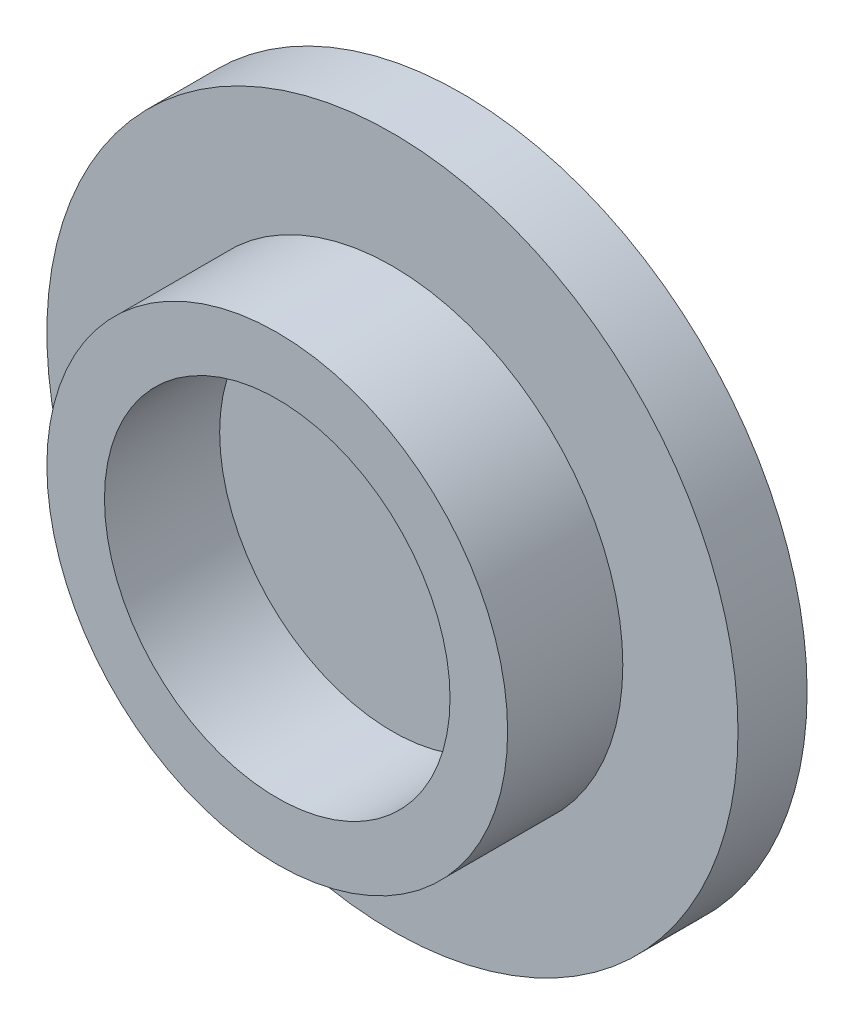
ISO-10303-21;
HEADER;
FILE_DESCRIPTION(('STEP AP214'),'2;1');
FILE_NAME('part.step','',(''),(''),'','','');
FILE_SCHEMA(('AUTOMOTIVE_DESIGN { 1 0 10303 214 1 1 1 1 }'));
ENDSEC;
DATA;
#1=APPLICATION_CONTEXT('core data for automotive mechanical design processes');
#2=APPLICATION_PROTOCOL_DEFINITION('international standard','automotive_design',2000,#1);
#3=PRODUCT_CONTEXT('',#1,'mechanical');
#4=PRODUCT('Part','Part','',(#3));
#5=PRODUCT_RELATED_PRODUCT_CATEGORY('part','',(#4));
#6=PRODUCT_DEFINITION_FORMATION('','',#4);
#7=PRODUCT_DEFINITION_CONTEXT('part definition',#1,'design');
#8=PRODUCT_DEFINITION('design','',#6,#7);
#9=PRODUCT_DEFINITION_SHAPE('','',#8);
#10=(LENGTH_UNIT() NAMED_UNIT(*) SI_UNIT(.MILLI.,.METRE.));
#11=(NAMED_UNIT(*) PLANE_ANGLE_UNIT() SI_UNIT($,.RADIAN.));
#12=(NAMED_UNIT(*) SI_UNIT($,.STERADIAN.) SOLID_ANGLE_UNIT());
#13=UNCERTAINTY_MEASURE_WITH_UNIT(LENGTH_MEASURE(1.E-05),#10,'distance_accuracy_value','');
#14=(GEOMETRIC_REPRESENTATION_CONTEXT(3) GLOBAL_UNCERTAINTY_ASSIGNED_CONTEXT((#13)) GLOBAL_UNIT_ASSIGNED_CONTEXT((#10,
#11,#12)) REPRESENTATION_CONTEXT('',''));
#15=CARTESIAN_POINT('',(0.,0.,0.));
#16=DIRECTION('',(0.,0.,1.));
#17=DIRECTION('',(1.,0.,0.));
#18=AXIS2_PLACEMENT_3D('',#15,#16,#17);
#19=CARTESIAN_POINT('',(0.,0.,3.));
#20=DIRECTION('',(0.,0.,-1.));
#21=DIRECTION('',(-1.,0.,0.));
#22=AXIS2_PLACEMENT_3D('',#19,#20,#21);
#23=CYLINDRICAL_SURFACE('',#22,15.);
#24=CARTESIAN_POINT('',(0.,0.,3.));
#25=DIRECTION('',(0.,0.,1.));
#26=DIRECTION('',(1.,0.,0.));
#27=AXIS2_PLACEMENT_3D('',#24,#25,#26);
#28=CIRCLE('',#27,15.);
#29=CARTESIAN_POINT('',(15.,0.,3.));
#30=VERTEX_POINT('',#29);
#31=EDGE_CURVE('E38',#30,#30,#28,.T.);
#32=ORIENTED_EDGE('',*,*,#31,.F.);
#33=EDGE_LOOP('',(#32));
#34=FACE_BOUND('',#33,.T.);
#35=CARTESIAN_POINT('',(0.,0.,0.));
#36=DIRECTION('',(0.,0.,1.));
#37=DIRECTION('',(1.,0.,0.));
#38=AXIS2_PLACEMENT_3D('',#35,#36,#37);
#39=CIRCLE('',#38,15.);
#40=CARTESIAN_POINT('',(15.,0.,0.));
#41=VERTEX_POINT('',#40);
#42=EDGE_CURVE('E42',#41,#41,#39,.T.);
#43=ORIENTED_EDGE('',*,*,#42,.T.);
#44=EDGE_LOOP('',(#43));
#45=FACE_BOUND('',#44,.T.);
#46=ADVANCED_FACE('F32',(#34,#45),#23,.T.);
#47=CARTESIAN_POINT('',(0.,0.,3.));
#48=DIRECTION('',(0.,0.,1.));
#49=DIRECTION('',(1.,0.,0.));
#50=AXIS2_PLACEMENT_3D('',#47,#48,#49);
#51=PLANE('',#50);
#52=CARTESIAN_POINT('',(0.,0.,3.));
#53=DIRECTION('',(0.,0.,1.));
#54=DIRECTION('',(1.,0.,0.));
#55=AXIS2_PLACEMENT_3D('',#52,#53,#54);
#56=CIRCLE('',#55,10.);
#57=CARTESIAN_POINT('',(10.,0.,3.));
#58=VERTEX_POINT('',#57);
#59=EDGE_CURVE('E49',#58,#58,#56,.T.);
#60=ORIENTED_EDGE('',*,*,#59,.F.);
#61=EDGE_LOOP('',(#60));
#62=FACE_BOUND('',#61,.T.);
#63=ORIENTED_EDGE('',*,*,#31,.T.);
#64=EDGE_LOOP('',(#63));
#65=FACE_BOUND('',#64,.T.);
#66=ADVANCED_FACE('F72',(#62,#65),#51,.T.);
#67=CARTESIAN_POINT('',(0.,0.,0.));
#68=DIRECTION('',(0.,0.,1.));
#69=DIRECTION('',(1.,0.,0.));
#70=AXIS2_PLACEMENT_3D('',#67,#68,#69);
#71=PLANE('',#70);
#72=ORIENTED_EDGE('',*,*,#42,.F.);
#73=EDGE_LOOP('',(#72));
#74=FACE_BOUND('',#73,.T.);
#75=ADVANCED_FACE('F63',(#74),#71,.F.);
#76=CARTESIAN_POINT('',(0.,0.,8.));
#77=DIRECTION('',(0.,0.,1.));
#78=DIRECTION('',(1.,0.,0.));
#79=AXIS2_PLACEMENT_3D('',#76,#77,#78);
#80=PLANE('',#79);
#81=CARTESIAN_POINT('',(0.,0.,8.));
#82=DIRECTION('',(0.,0.,1.));
#83=DIRECTION('',(1.,0.,0.));
#84=AXIS2_PLACEMENT_3D('',#81,#82,#83);
#85=CIRCLE('',#84,10.);
#86=CARTESIAN_POINT('',(10.,0.,8.));
#87=VERTEX_POINT('',#86);
#88=EDGE_CURVE('E47',#87,#87,#85,.T.);
#89=ORIENTED_EDGE('',*,*,#88,.T.);
#90=EDGE_LOOP('',(#89));
#91=FACE_BOUND('',#90,.T.);
#92=CARTESIAN_POINT('',(0.,0.,8.));
#93=DIRECTION('',(0.,0.,1.));
#94=DIRECTION('',(1.,0.,0.));
#95=AXIS2_PLACEMENT_3D('',#92,#93,#94);
#96=CIRCLE('',#95,7.5);
#97=CARTESIAN_POINT('',(7.5,0.,8.));
#98=VERTEX_POINT('',#97);
#99=EDGE_CURVE('E52',#98,#98,#96,.T.);
#100=ORIENTED_EDGE('',*,*,#99,.F.);
#101=EDGE_LOOP('',(#100));
#102=FACE_BOUND('',#101,.T.);
#103=ADVANCED_FACE('F60',(#91,#102),#80,.T.);
#104=CARTESIAN_POINT('',(0.,0.,8.));
#105=DIRECTION('',(0.,0.,-1.));
#106=DIRECTION('',(-1.,0.,0.));
#107=AXIS2_PLACEMENT_3D('',#104,#105,#106);
#108=CYLINDRICAL_SURFACE('',#107,10.);
#109=ORIENTED_EDGE('',*,*,#88,.F.);
#110=EDGE_LOOP('',(#109));
#111=FACE_BOUND('',#110,.T.);
#112=ORIENTED_EDGE('',*,*,#59,.T.);
#113=EDGE_LOOP('',(#112));
#114=FACE_BOUND('',#113,.T.);
#115=ADVANCED_FACE('F62',(#111,#114),#108,.T.);
#116=CARTESIAN_POINT('',(0.,0.,8.));
#117=DIRECTION('',(0.,0.,-1.));
#118=DIRECTION('',(-1.,0.,0.));
#119=AXIS2_PLACEMENT_3D('',#116,#117,#118);
#120=CYLINDRICAL_SURFACE('',#119,7.5);
#121=ORIENTED_EDGE('',*,*,#99,.T.);
#122=EDGE_LOOP('',(#121));
#123=FACE_BOUND('',#122,.T.);
#124=CARTESIAN_POINT('',(0.,0.,3.));
#125=DIRECTION('',(0.,0.,1.));
#126=DIRECTION('',(1.,0.,0.));
#127=AXIS2_PLACEMENT_3D('',#124,#125,#126);
#128=CIRCLE('',#127,7.5);
#129=CARTESIAN_POINT('',(7.5,0.,3.));
#130=VERTEX_POINT('',#129);
#131=EDGE_CURVE('E10',#130,#130,#128,.F.);
#132=ORIENTED_EDGE('',*,*,#131,.T.);
#133=EDGE_LOOP('',(#132));
#134=FACE_BOUND('',#133,.T.);
#135=ADVANCED_FACE('F58',(#123,#134),#120,.F.);
#136=ORIENTED_EDGE('',*,*,#131,.F.);
#137=EDGE_LOOP('',(#136));
#138=FACE_BOUND('',#137,.T.);
#139=ADVANCED_FACE('F82',(#138),#51,.T.);
#140=CLOSED_SHELL('',(#46,#66,#75,#103,#115,#135,#139));
#141=MANIFOLD_SOLID_BREP('B2',#140);
#142=ADVANCED_BREP_SHAPE_REPRESENTATION('',(#18,#141),#14);
#143=SHAPE_DEFINITION_REPRESENTATION(#9,#142);
ENDSEC;
END-ISO-10303-21;
